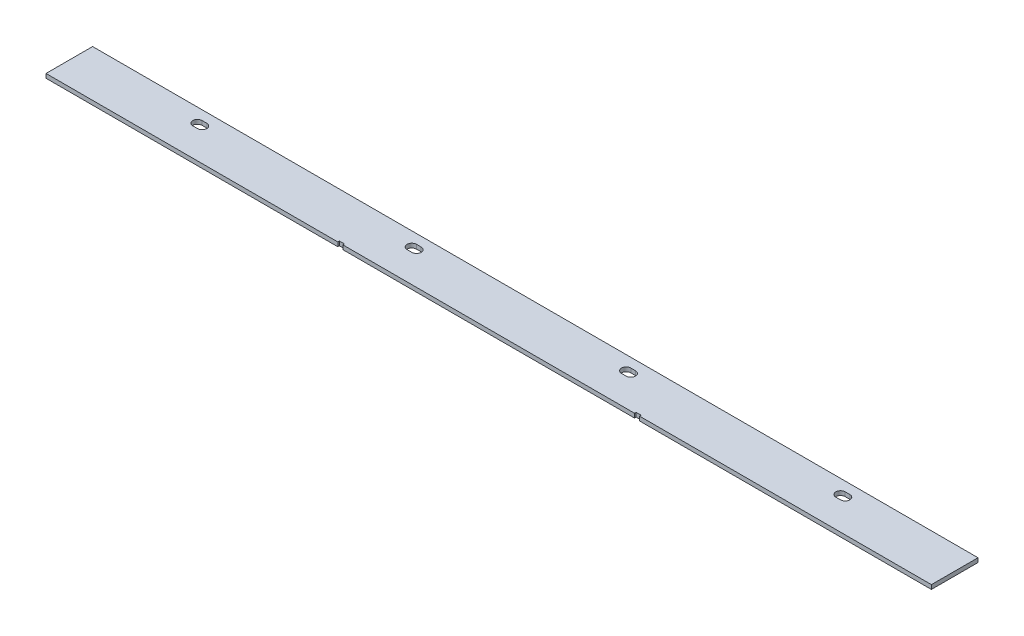
ISO-10303-21;
HEADER;
FILE_DESCRIPTION(('STEP AP214'),'2;1');
FILE_NAME('part.step','',(''),(''),'','','');
FILE_SCHEMA(('AUTOMOTIVE_DESIGN { 1 0 10303 214 1 1 1 1 }'));
ENDSEC;
DATA;
#1=APPLICATION_CONTEXT('core data for automotive mechanical design processes');
#2=APPLICATION_PROTOCOL_DEFINITION('international standard','automotive_design',2000,#1);
#3=PRODUCT_CONTEXT('',#1,'mechanical');
#4=PRODUCT('Part','Part','',(#3));
#5=PRODUCT_RELATED_PRODUCT_CATEGORY('part','',(#4));
#6=PRODUCT_DEFINITION_FORMATION('','',#4);
#7=PRODUCT_DEFINITION_CONTEXT('part definition',#1,'design');
#8=PRODUCT_DEFINITION('design','',#6,#7);
#9=PRODUCT_DEFINITION_SHAPE('','',#8);
#10=(LENGTH_UNIT() NAMED_UNIT(*) SI_UNIT(.MILLI.,.METRE.));
#11=(NAMED_UNIT(*) PLANE_ANGLE_UNIT() SI_UNIT($,.RADIAN.));
#12=(NAMED_UNIT(*) SI_UNIT($,.STERADIAN.) SOLID_ANGLE_UNIT());
#13=UNCERTAINTY_MEASURE_WITH_UNIT(LENGTH_MEASURE(1.E-05),#10,'distance_accuracy_value','');
#14=(GEOMETRIC_REPRESENTATION_CONTEXT(3) GLOBAL_UNCERTAINTY_ASSIGNED_CONTEXT((#13)) GLOBAL_UNIT_ASSIGNED_CONTEXT((#10,
#11,#12)) REPRESENTATION_CONTEXT('',''));
#15=CARTESIAN_POINT('',(0.,0.,0.));
#16=DIRECTION('',(0.,0.,1.));
#17=DIRECTION('',(1.,0.,0.));
#18=AXIS2_PLACEMENT_3D('',#15,#16,#17);
#19=CARTESIAN_POINT('',(335.75,-495.5,1.5));
#20=DIRECTION('',(0.,1.,0.));
#21=DIRECTION('',(0.,0.,1.));
#22=AXIS2_PLACEMENT_3D('',#19,#20,#21);
#23=PLANE('',#22);
#24=DIRECTION('',(-1.,0.,0.));
#25=VECTOR('',#24,1.);
#26=CARTESIAN_POINT('',(233.25,-495.5,10.));
#27=LINE('',#26,#25);
#28=CARTESIAN_POINT('',(233.25,-495.5,10.));
#29=VERTEX_POINT('',#28);
#30=CARTESIAN_POINT('',(238.25,-495.5,10.));
#31=VERTEX_POINT('',#30);
#32=EDGE_CURVE('E395',#29,#31,#27,.F.);
#33=ORIENTED_EDGE('',*,*,#32,.T.);
#34=CARTESIAN_POINT('',(238.25,-495.5,15.));
#35=DIRECTION('',(0.,1.,0.));
#36=DIRECTION('',(0.,0.,1.));
#37=AXIS2_PLACEMENT_3D('',#34,#35,#36);
#38=CIRCLE('',#37,4.99999999999999);
#39=CARTESIAN_POINT('',(238.25,-495.5,20.));
#40=VERTEX_POINT('',#39);
#41=EDGE_CURVE('E381',#31,#40,#38,.F.);
#42=ORIENTED_EDGE('',*,*,#41,.T.);
#43=DIRECTION('',(1.,0.,0.));
#44=VECTOR('',#43,1.);
#45=CARTESIAN_POINT('',(233.25,-495.5,20.));
#46=LINE('',#45,#44);
#47=CARTESIAN_POINT('',(233.25,-495.5,20.));
#48=VERTEX_POINT('',#47);
#49=EDGE_CURVE('E403',#40,#48,#46,.F.);
#50=ORIENTED_EDGE('',*,*,#49,.T.);
#51=CARTESIAN_POINT('',(233.25,-495.5,15.));
#52=DIRECTION('',(0.,1.,0.));
#53=DIRECTION('',(0.,0.,1.));
#54=AXIS2_PLACEMENT_3D('',#51,#52,#53);
#55=CIRCLE('',#54,4.99999999999999);
#56=EDGE_CURVE('E399',#48,#29,#55,.F.);
#57=ORIENTED_EDGE('',*,*,#56,.T.);
#58=EDGE_LOOP('',(#33,#42,#50,#57));
#59=FACE_BOUND('',#58,.T.);
#60=CARTESIAN_POINT('',(8.25000000000001,-495.5,15.));
#61=DIRECTION('',(0.,1.,0.));
#62=DIRECTION('',(0.,0.,1.));
#63=AXIS2_PLACEMENT_3D('',#60,#61,#62);
#64=CIRCLE('',#63,4.99999999999999);
#65=CARTESIAN_POINT('',(8.25000000000001,-495.5,10.));
#66=VERTEX_POINT('',#65);
#67=CARTESIAN_POINT('',(8.25000000000001,-495.5,20.));
#68=VERTEX_POINT('',#67);
#69=EDGE_CURVE('E418',#66,#68,#64,.F.);
#70=ORIENTED_EDGE('',*,*,#69,.T.);
#71=DIRECTION('',(1.,0.,0.));
#72=VECTOR('',#71,1.);
#73=CARTESIAN_POINT('',(3.25,-495.5,20.));
#74=LINE('',#73,#72);
#75=CARTESIAN_POINT('',(3.25,-495.5,20.));
#76=VERTEX_POINT('',#75);
#77=EDGE_CURVE('E414',#68,#76,#74,.F.);
#78=ORIENTED_EDGE('',*,*,#77,.T.);
#79=CARTESIAN_POINT('',(3.25,-495.5,15.));
#80=DIRECTION('',(0.,1.,0.));
#81=DIRECTION('',(0.,0.,1.));
#82=AXIS2_PLACEMENT_3D('',#79,#80,#81);
#83=CIRCLE('',#82,4.99999999999999);
#84=CARTESIAN_POINT('',(3.24999999999999,-495.5,10.));
#85=VERTEX_POINT('',#84);
#86=EDGE_CURVE('E408',#76,#85,#83,.F.);
#87=ORIENTED_EDGE('',*,*,#86,.T.);
#88=DIRECTION('',(-1.,0.,0.));
#89=VECTOR('',#88,1.);
#90=CARTESIAN_POINT('',(3.25,-495.5,10.));
#91=LINE('',#90,#89);
#92=EDGE_CURVE('E407',#85,#66,#91,.F.);
#93=ORIENTED_EDGE('',*,*,#92,.T.);
#94=EDGE_LOOP('',(#70,#78,#87,#93));
#95=FACE_BOUND('',#94,.T.);
#96=CARTESIAN_POINT('',(-456.75,-495.5,15.));
#97=DIRECTION('',(0.,1.,0.));
#98=DIRECTION('',(0.,0.,1.));
#99=AXIS2_PLACEMENT_3D('',#96,#97,#98);
#100=CIRCLE('',#99,5.);
#101=CARTESIAN_POINT('',(-456.75,-495.5,20.));
#102=VERTEX_POINT('',#101);
#103=CARTESIAN_POINT('',(-456.75,-495.5,10.));
#104=VERTEX_POINT('',#103);
#105=EDGE_CURVE('E364',#102,#104,#100,.F.);
#106=ORIENTED_EDGE('',*,*,#105,.T.);
#107=DIRECTION('',(-1.,0.,0.));
#108=VECTOR('',#107,1.);
#109=CARTESIAN_POINT('',(-456.75,-495.5,10.));
#110=LINE('',#109,#108);
#111=CARTESIAN_POINT('',(-451.75,-495.5,10.));
#112=VERTEX_POINT('',#111);
#113=EDGE_CURVE('E440',#104,#112,#110,.F.);
#114=ORIENTED_EDGE('',*,*,#113,.T.);
#115=CARTESIAN_POINT('',(-451.75,-495.5,15.));
#116=DIRECTION('',(0.,1.,0.));
#117=DIRECTION('',(0.,0.,1.));
#118=AXIS2_PLACEMENT_3D('',#115,#116,#117);
#119=CIRCLE('',#118,5.);
#120=CARTESIAN_POINT('',(-451.75,-495.5,20.));
#121=VERTEX_POINT('',#120);
#122=EDGE_CURVE('E436',#112,#121,#119,.F.);
#123=ORIENTED_EDGE('',*,*,#122,.T.);
#124=DIRECTION('',(1.,0.,0.));
#125=VECTOR('',#124,1.);
#126=CARTESIAN_POINT('',(-456.75,-495.5,20.));
#127=LINE('',#126,#125);
#128=EDGE_CURVE('E447',#121,#102,#127,.F.);
#129=ORIENTED_EDGE('',*,*,#128,.T.);
#130=EDGE_LOOP('',(#106,#114,#123,#129));
#131=FACE_BOUND('',#130,.T.);
#132=DIRECTION('',(1.,0.,0.));
#133=VECTOR('',#132,1.);
#134=CARTESIAN_POINT('',(-226.75,-495.5,20.));
#135=LINE('',#134,#133);
#136=CARTESIAN_POINT('',(-221.75,-495.5,20.));
#137=VERTEX_POINT('',#136);
#138=CARTESIAN_POINT('',(-226.75,-495.5,20.));
#139=VERTEX_POINT('',#138);
#140=EDGE_CURVE('E422',#137,#139,#135,.F.);
#141=ORIENTED_EDGE('',*,*,#140,.T.);
#142=CARTESIAN_POINT('',(-226.75,-495.5,15.));
#143=DIRECTION('',(0.,1.,0.));
#144=DIRECTION('',(0.,0.,1.));
#145=AXIS2_PLACEMENT_3D('',#142,#143,#144);
#146=CIRCLE('',#145,4.99999999999999);
#147=CARTESIAN_POINT('',(-226.75,-495.5,10.));
#148=VERTEX_POINT('',#147);
#149=EDGE_CURVE('E433',#139,#148,#146,.F.);
#150=ORIENTED_EDGE('',*,*,#149,.T.);
#151=DIRECTION('',(-1.,0.,0.));
#152=VECTOR('',#151,1.);
#153=CARTESIAN_POINT('',(-226.75,-495.5,10.));
#154=LINE('',#153,#152);
#155=CARTESIAN_POINT('',(-221.75,-495.5,10.));
#156=VERTEX_POINT('',#155);
#157=EDGE_CURVE('E429',#148,#156,#154,.F.);
#158=ORIENTED_EDGE('',*,*,#157,.T.);
#159=CARTESIAN_POINT('',(-221.75,-495.5,15.));
#160=DIRECTION('',(0.,1.,0.));
#161=DIRECTION('',(0.,0.,1.));
#162=AXIS2_PLACEMENT_3D('',#159,#160,#161);
#163=CIRCLE('',#162,4.99999999999999);
#164=EDGE_CURVE('E423',#156,#137,#163,.F.);
#165=ORIENTED_EDGE('',*,*,#164,.T.);
#166=EDGE_LOOP('',(#141,#150,#158,#165));
#167=FACE_BOUND('',#166,.T.);
#168=DIRECTION('',(-1.,0.,0.));
#169=VECTOR('',#168,1.);
#170=CARTESIAN_POINT('',(0.,-495.5,50.));
#171=LINE('',#170,#169);
#172=CARTESIAN_POINT('',(-271.116666666667,-495.5,50.));
#173=VERTEX_POINT('',#172);
#174=CARTESIAN_POINT('',(-584.25,-495.5,50.));
#175=VERTEX_POINT('',#174);
#176=EDGE_CURVE('E358',#173,#175,#171,.T.);
#177=ORIENTED_EDGE('',*,*,#176,.F.);
#178=DIRECTION('',(0.,0.,-1.));
#179=VECTOR('',#178,1.);
#180=CARTESIAN_POINT('',(-271.116666666667,-495.5,50.2));
#181=LINE('',#180,#179);
#182=CARTESIAN_POINT('',(-271.116666666667,-495.5,48.2999999999999));
#183=VERTEX_POINT('',#182);
#184=EDGE_CURVE('E288',#173,#183,#181,.T.);
#185=ORIENTED_EDGE('',*,*,#184,.T.);
#186=DIRECTION('',(-1.,0.,0.));
#187=VECTOR('',#186,1.);
#188=CARTESIAN_POINT('',(-271.116666666667,-495.5,48.2999999999999));
#189=LINE('',#188,#187);
#190=CARTESIAN_POINT('',(-265.716666666667,-495.5,48.2999999999999));
#191=VERTEX_POINT('',#190);
#192=EDGE_CURVE('E277',#191,#183,#189,.T.);
#193=ORIENTED_EDGE('',*,*,#192,.F.);
#194=DIRECTION('',(0.,0.,-1.));
#195=VECTOR('',#194,1.);
#196=CARTESIAN_POINT('',(-265.716666666667,-495.5,50.2));
#197=LINE('',#196,#195);
#198=CARTESIAN_POINT('',(-265.716666666667,-495.5,50.));
#199=VERTEX_POINT('',#198);
#200=EDGE_CURVE('E290',#199,#191,#197,.T.);
#201=ORIENTED_EDGE('',*,*,#200,.F.);
#202=CARTESIAN_POINT('',(47.2166666666666,-495.5,50.));
#203=VERTEX_POINT('',#202);
#204=EDGE_CURVE('E346',#203,#199,#171,.T.);
#205=ORIENTED_EDGE('',*,*,#204,.F.);
#206=DIRECTION('',(0.,0.,-1.));
#207=VECTOR('',#206,1.);
#208=CARTESIAN_POINT('',(47.2166666666666,-495.5,50.2));
#209=LINE('',#208,#207);
#210=CARTESIAN_POINT('',(47.2166666666666,-495.5,48.2999999999999));
#211=VERTEX_POINT('',#210);
#212=EDGE_CURVE('E305',#203,#211,#209,.T.);
#213=ORIENTED_EDGE('',*,*,#212,.T.);
#214=DIRECTION('',(-1.,0.,0.));
#215=VECTOR('',#214,1.);
#216=CARTESIAN_POINT('',(47.2166666666666,-495.5,48.2999999999999));
#217=LINE('',#216,#215);
#218=CARTESIAN_POINT('',(52.6166666666666,-495.5,48.2999999999999));
#219=VERTEX_POINT('',#218);
#220=EDGE_CURVE('E302',#219,#211,#217,.T.);
#221=ORIENTED_EDGE('',*,*,#220,.F.);
#222=DIRECTION('',(0.,0.,-1.));
#223=VECTOR('',#222,1.);
#224=CARTESIAN_POINT('',(52.6166666666666,-495.5,50.2));
#225=LINE('',#224,#223);
#226=CARTESIAN_POINT('',(52.6166666666666,-495.5,50.));
#227=VERTEX_POINT('',#226);
#228=EDGE_CURVE('E308',#227,#219,#225,.T.);
#229=ORIENTED_EDGE('',*,*,#228,.F.);
#230=CARTESIAN_POINT('',(365.75,-495.5,50.));
#231=VERTEX_POINT('',#230);
#232=EDGE_CURVE('E319',#231,#227,#171,.T.);
#233=ORIENTED_EDGE('',*,*,#232,.F.);
#234=DIRECTION('',(0.,0.,-1.));
#235=VECTOR('',#234,1.);
#236=CARTESIAN_POINT('',(365.75,-495.5,50.));
#237=LINE('',#236,#235);
#238=CARTESIAN_POINT('',(365.75,-495.5,0.));
#239=VERTEX_POINT('',#238);
#240=EDGE_CURVE('E361',#231,#239,#237,.T.);
#241=ORIENTED_EDGE('',*,*,#240,.T.);
#242=DIRECTION('',(1.,0.,0.));
#243=VECTOR('',#242,1.);
#244=CARTESIAN_POINT('',(0.,-495.5,0.));
#245=LINE('',#244,#243);
#246=CARTESIAN_POINT('',(-584.25,-495.5,0.));
#247=VERTEX_POINT('',#246);
#248=EDGE_CURVE('E322',#239,#247,#245,.F.);
#249=ORIENTED_EDGE('',*,*,#248,.T.);
#250=DIRECTION('',(0.,0.,1.));
#251=VECTOR('',#250,1.);
#252=CARTESIAN_POINT('',(-584.25,-495.5,50.));
#253=LINE('',#252,#251);
#254=EDGE_CURVE('E269',#247,#175,#253,.T.);
#255=ORIENTED_EDGE('',*,*,#254,.T.);
#256=EDGE_LOOP('',(#177,#185,#193,#201,#205,#213,#221,#229,#233,#241,#249,#255));
#257=FACE_BOUND('',#256,.T.);
#258=ADVANCED_FACE('F42',(#59,#95,#131,#167,#257),#23,.T.);
#259=CARTESIAN_POINT('',(-584.25,-500.,50.));
#260=DIRECTION('',(0.,1.,0.));
#261=DIRECTION('',(0.,0.,1.));
#262=AXIS2_PLACEMENT_3D('',#259,#260,#261);
#263=PLANE('',#262);
#264=DIRECTION('',(1.,0.,0.));
#265=VECTOR('',#264,1.);
#266=CARTESIAN_POINT('',(-584.25,-500.,10.));
#267=LINE('',#266,#265);
#268=CARTESIAN_POINT('',(233.25,-500.,10.));
#269=VERTEX_POINT('',#268);
#270=CARTESIAN_POINT('',(238.25,-500.,10.));
#271=VERTEX_POINT('',#270);
#272=EDGE_CURVE('E328',#269,#271,#267,.T.);
#273=ORIENTED_EDGE('',*,*,#272,.F.);
#274=CARTESIAN_POINT('',(233.25,-500.,15.));
#275=DIRECTION('',(0.,1.,0.));
#276=DIRECTION('',(0.,0.,1.));
#277=AXIS2_PLACEMENT_3D('',#274,#275,#276);
#278=CIRCLE('',#277,4.99999999999999);
#279=CARTESIAN_POINT('',(233.25,-500.,20.));
#280=VERTEX_POINT('',#279);
#281=EDGE_CURVE('E461',#280,#269,#278,.F.);
#282=ORIENTED_EDGE('',*,*,#281,.F.);
#283=DIRECTION('',(1.,0.,0.));
#284=VECTOR('',#283,1.);
#285=CARTESIAN_POINT('',(-584.25,-500.,20.));
#286=LINE('',#285,#284);
#287=CARTESIAN_POINT('',(238.25,-500.,20.));
#288=VERTEX_POINT('',#287);
#289=EDGE_CURVE('E463',#288,#280,#286,.F.);
#290=ORIENTED_EDGE('',*,*,#289,.F.);
#291=CARTESIAN_POINT('',(238.25,-500.,15.));
#292=DIRECTION('',(0.,1.,0.));
#293=DIRECTION('',(0.,0.,1.));
#294=AXIS2_PLACEMENT_3D('',#291,#292,#293);
#295=CIRCLE('',#294,4.99999999999999);
#296=EDGE_CURVE('E340',#271,#288,#295,.F.);
#297=ORIENTED_EDGE('',*,*,#296,.F.);
#298=EDGE_LOOP('',(#273,#282,#290,#297));
#299=FACE_BOUND('',#298,.T.);
#300=CARTESIAN_POINT('',(3.25,-500.,15.));
#301=DIRECTION('',(0.,1.,0.));
#302=DIRECTION('',(0.,0.,1.));
#303=AXIS2_PLACEMENT_3D('',#300,#301,#302);
#304=CIRCLE('',#303,4.99999999999999);
#305=CARTESIAN_POINT('',(3.24999999999999,-500.,20.));
#306=VERTEX_POINT('',#305);
#307=CARTESIAN_POINT('',(3.24999999999999,-500.,10.));
#308=VERTEX_POINT('',#307);
#309=EDGE_CURVE('E464',#306,#308,#304,.F.);
#310=ORIENTED_EDGE('',*,*,#309,.F.);
#311=DIRECTION('',(1.,0.,0.));
#312=VECTOR('',#311,1.);
#313=CARTESIAN_POINT('',(-584.25,-500.,20.));
#314=LINE('',#313,#312);
#315=CARTESIAN_POINT('',(8.25,-500.,20.));
#316=VERTEX_POINT('',#315);
#317=EDGE_CURVE('E467',#316,#306,#314,.F.);
#318=ORIENTED_EDGE('',*,*,#317,.F.);
#319=CARTESIAN_POINT('',(8.25000000000001,-500.,15.));
#320=DIRECTION('',(0.,1.,0.));
#321=DIRECTION('',(0.,0.,1.));
#322=AXIS2_PLACEMENT_3D('',#319,#320,#321);
#323=CIRCLE('',#322,4.99999999999999);
#324=CARTESIAN_POINT('',(8.25,-500.,10.));
#325=VERTEX_POINT('',#324);
#326=EDGE_CURVE('E468',#325,#316,#323,.F.);
#327=ORIENTED_EDGE('',*,*,#326,.F.);
#328=DIRECTION('',(1.,0.,0.));
#329=VECTOR('',#328,1.);
#330=CARTESIAN_POINT('',(-584.25,-500.,10.));
#331=LINE('',#330,#329);
#332=EDGE_CURVE('E466',#308,#325,#331,.T.);
#333=ORIENTED_EDGE('',*,*,#332,.F.);
#334=EDGE_LOOP('',(#310,#318,#327,#333));
#335=FACE_BOUND('',#334,.T.);
#336=CARTESIAN_POINT('',(-221.75,-500.,15.));
#337=DIRECTION('',(0.,1.,0.));
#338=DIRECTION('',(0.,0.,1.));
#339=AXIS2_PLACEMENT_3D('',#336,#337,#338);
#340=CIRCLE('',#339,4.99999999999999);
#341=CARTESIAN_POINT('',(-221.75,-500.,10.));
#342=VERTEX_POINT('',#341);
#343=CARTESIAN_POINT('',(-221.75,-500.,20.));
#344=VERTEX_POINT('',#343);
#345=EDGE_CURVE('E471',#342,#344,#340,.F.);
#346=ORIENTED_EDGE('',*,*,#345,.F.);
#347=DIRECTION('',(1.,0.,0.));
#348=VECTOR('',#347,1.);
#349=CARTESIAN_POINT('',(-584.25,-500.,10.));
#350=LINE('',#349,#348);
#351=CARTESIAN_POINT('',(-226.75,-500.,10.));
#352=VERTEX_POINT('',#351);
#353=EDGE_CURVE('E473',#352,#342,#350,.T.);
#354=ORIENTED_EDGE('',*,*,#353,.F.);
#355=CARTESIAN_POINT('',(-226.75,-500.,15.));
#356=DIRECTION('',(0.,1.,0.));
#357=DIRECTION('',(0.,0.,1.));
#358=AXIS2_PLACEMENT_3D('',#355,#356,#357);
#359=CIRCLE('',#358,4.99999999999999);
#360=CARTESIAN_POINT('',(-226.75,-500.,20.));
#361=VERTEX_POINT('',#360);
#362=EDGE_CURVE('E474',#361,#352,#359,.F.);
#363=ORIENTED_EDGE('',*,*,#362,.F.);
#364=DIRECTION('',(1.,0.,0.));
#365=VECTOR('',#364,1.);
#366=CARTESIAN_POINT('',(-584.25,-500.,20.));
#367=LINE('',#366,#365);
#368=EDGE_CURVE('E470',#344,#361,#367,.F.);
#369=ORIENTED_EDGE('',*,*,#368,.F.);
#370=EDGE_LOOP('',(#346,#354,#363,#369));
#371=FACE_BOUND('',#370,.T.);
#372=DIRECTION('',(1.,0.,0.));
#373=VECTOR('',#372,1.);
#374=CARTESIAN_POINT('',(-584.25,-500.,10.));
#375=LINE('',#374,#373);
#376=CARTESIAN_POINT('',(-456.75,-500.,10.));
#377=VERTEX_POINT('',#376);
#378=CARTESIAN_POINT('',(-451.75,-500.,10.));
#379=VERTEX_POINT('',#378);
#380=EDGE_CURVE('E479',#377,#379,#375,.T.);
#381=ORIENTED_EDGE('',*,*,#380,.F.);
#382=CARTESIAN_POINT('',(-456.75,-500.,15.));
#383=DIRECTION('',(0.,1.,0.));
#384=DIRECTION('',(0.,0.,1.));
#385=AXIS2_PLACEMENT_3D('',#382,#383,#384);
#386=CIRCLE('',#385,5.);
#387=CARTESIAN_POINT('',(-456.75,-500.,20.));
#388=VERTEX_POINT('',#387);
#389=EDGE_CURVE('E480',#388,#377,#386,.F.);
#390=ORIENTED_EDGE('',*,*,#389,.F.);
#391=DIRECTION('',(1.,0.,0.));
#392=VECTOR('',#391,1.);
#393=CARTESIAN_POINT('',(-584.25,-500.,20.));
#394=LINE('',#393,#392);
#395=CARTESIAN_POINT('',(-451.75,-500.,20.));
#396=VERTEX_POINT('',#395);
#397=EDGE_CURVE('E391',#396,#388,#394,.F.);
#398=ORIENTED_EDGE('',*,*,#397,.F.);
#399=CARTESIAN_POINT('',(-451.75,-500.,15.));
#400=DIRECTION('',(0.,1.,0.));
#401=DIRECTION('',(0.,0.,1.));
#402=AXIS2_PLACEMENT_3D('',#399,#400,#401);
#403=CIRCLE('',#402,5.);
#404=EDGE_CURVE('E476',#379,#396,#403,.F.);
#405=ORIENTED_EDGE('',*,*,#404,.F.);
#406=EDGE_LOOP('',(#381,#390,#398,#405));
#407=FACE_BOUND('',#406,.T.);
#408=DIRECTION('',(0.,0.,-1.));
#409=VECTOR('',#408,1.);
#410=CARTESIAN_POINT('',(-271.116666666667,-500.,50.2));
#411=LINE('',#410,#409);
#412=CARTESIAN_POINT('',(-271.116666666667,-500.,50.));
#413=VERTEX_POINT('',#412);
#414=CARTESIAN_POINT('',(-271.116666666667,-500.,48.2999999999999));
#415=VERTEX_POINT('',#414);
#416=EDGE_CURVE('E260',#413,#415,#411,.T.);
#417=ORIENTED_EDGE('',*,*,#416,.F.);
#418=DIRECTION('',(1.,0.,0.));
#419=VECTOR('',#418,1.);
#420=CARTESIAN_POINT('',(0.,-500.,50.));
#421=LINE('',#420,#419);
#422=CARTESIAN_POINT('',(-584.25,-500.,50.));
#423=VERTEX_POINT('',#422);
#424=EDGE_CURVE('E320',#423,#413,#421,.T.);
#425=ORIENTED_EDGE('',*,*,#424,.F.);
#426=DIRECTION('',(0.,0.,1.));
#427=VECTOR('',#426,1.);
#428=CARTESIAN_POINT('',(-584.25,-500.,50.));
#429=LINE('',#428,#427);
#430=CARTESIAN_POINT('',(-584.25,-500.,0.));
#431=VERTEX_POINT('',#430);
#432=EDGE_CURVE('E312',#431,#423,#429,.T.);
#433=ORIENTED_EDGE('',*,*,#432,.F.);
#434=DIRECTION('',(1.,0.,0.));
#435=VECTOR('',#434,1.);
#436=CARTESIAN_POINT('',(-584.25,-500.,0.));
#437=LINE('',#436,#435);
#438=CARTESIAN_POINT('',(365.75,-500.,0.));
#439=VERTEX_POINT('',#438);
#440=EDGE_CURVE('E379',#439,#431,#437,.F.);
#441=ORIENTED_EDGE('',*,*,#440,.F.);
#442=DIRECTION('',(0.,0.,1.));
#443=VECTOR('',#442,1.);
#444=CARTESIAN_POINT('',(365.75,-500.,50.));
#445=LINE('',#444,#443);
#446=CARTESIAN_POINT('',(365.75,-500.,50.));
#447=VERTEX_POINT('',#446);
#448=EDGE_CURVE('E316',#447,#439,#445,.F.);
#449=ORIENTED_EDGE('',*,*,#448,.F.);
#450=CARTESIAN_POINT('',(52.6166666666666,-500.,50.));
#451=VERTEX_POINT('',#450);
#452=EDGE_CURVE('E324',#451,#447,#421,.T.);
#453=ORIENTED_EDGE('',*,*,#452,.F.);
#454=DIRECTION('',(0.,0.,-1.));
#455=VECTOR('',#454,1.);
#456=CARTESIAN_POINT('',(52.6166666666666,-500.,50.2));
#457=LINE('',#456,#455);
#458=CARTESIAN_POINT('',(52.6166666666666,-500.,48.2999999999999));
#459=VERTEX_POINT('',#458);
#460=EDGE_CURVE('E57',#451,#459,#457,.T.);
#461=ORIENTED_EDGE('',*,*,#460,.T.);
#462=DIRECTION('',(1.,0.,0.));
#463=VECTOR('',#462,1.);
#464=CARTESIAN_POINT('',(47.2166666666666,-500.,48.2999999999999));
#465=LINE('',#464,#463);
#466=CARTESIAN_POINT('',(47.2166666666666,-500.,48.2999999999999));
#467=VERTEX_POINT('',#466);
#468=EDGE_CURVE('E296',#467,#459,#465,.T.);
#469=ORIENTED_EDGE('',*,*,#468,.F.);
#470=DIRECTION('',(0.,0.,-1.));
#471=VECTOR('',#470,1.);
#472=CARTESIAN_POINT('',(47.2166666666666,-500.,50.2));
#473=LINE('',#472,#471);
#474=CARTESIAN_POINT('',(47.2166666666666,-500.,50.));
#475=VERTEX_POINT('',#474);
#476=EDGE_CURVE('E279',#475,#467,#473,.T.);
#477=ORIENTED_EDGE('',*,*,#476,.F.);
#478=CARTESIAN_POINT('',(-265.716666666667,-500.,50.));
#479=VERTEX_POINT('',#478);
#480=EDGE_CURVE('E323',#479,#475,#421,.T.);
#481=ORIENTED_EDGE('',*,*,#480,.F.);
#482=DIRECTION('',(0.,0.,-1.));
#483=VECTOR('',#482,1.);
#484=CARTESIAN_POINT('',(-265.716666666667,-500.,50.2));
#485=LINE('',#484,#483);
#486=CARTESIAN_POINT('',(-265.716666666667,-500.,48.2999999999999));
#487=VERTEX_POINT('',#486);
#488=EDGE_CURVE('E65',#479,#487,#485,.T.);
#489=ORIENTED_EDGE('',*,*,#488,.T.);
#490=DIRECTION('',(1.,0.,0.));
#491=VECTOR('',#490,1.);
#492=CARTESIAN_POINT('',(-271.116666666667,-500.,48.2999999999999));
#493=LINE('',#492,#491);
#494=EDGE_CURVE('E275',#415,#487,#493,.T.);
#495=ORIENTED_EDGE('',*,*,#494,.F.);
#496=EDGE_LOOP('',(#417,#425,#433,#441,#449,#453,#461,#469,#477,#481,#489,#495));
#497=FACE_BOUND('',#496,.T.);
#498=ADVANCED_FACE('F281',(#299,#335,#371,#407,#497),#263,.F.);
#499=CARTESIAN_POINT('',(0.,0.,50.));
#500=DIRECTION('',(0.,0.,1.));
#501=DIRECTION('',(1.,0.,0.));
#502=AXIS2_PLACEMENT_3D('',#499,#500,#501);
#503=PLANE('',#502);
#504=ORIENTED_EDGE('',*,*,#424,.T.);
#505=DIRECTION('',(0.,1.,0.));
#506=VECTOR('',#505,1.);
#507=CARTESIAN_POINT('',(-271.116666666667,0.,50.));
#508=LINE('',#507,#506);
#509=EDGE_CURVE('E11',#413,#173,#508,.T.);
#510=ORIENTED_EDGE('',*,*,#509,.T.);
#511=ORIENTED_EDGE('',*,*,#176,.T.);
#512=DIRECTION('',(0.,1.,0.));
#513=VECTOR('',#512,1.);
#514=CARTESIAN_POINT('',(-584.25,0.,50.));
#515=LINE('',#514,#513);
#516=EDGE_CURVE('E327',#175,#423,#515,.F.);
#517=ORIENTED_EDGE('',*,*,#516,.T.);
#518=EDGE_LOOP('',(#504,#510,#511,#517));
#519=FACE_BOUND('',#518,.T.);
#520=ADVANCED_FACE('F44',(#519),#503,.T.);
#521=ORIENTED_EDGE('',*,*,#204,.T.);
#522=DIRECTION('',(0.,-1.,0.));
#523=VECTOR('',#522,1.);
#524=CARTESIAN_POINT('',(-265.716666666667,0.,50.));
#525=LINE('',#524,#523);
#526=EDGE_CURVE('E50',#199,#479,#525,.T.);
#527=ORIENTED_EDGE('',*,*,#526,.T.);
#528=ORIENTED_EDGE('',*,*,#480,.T.);
#529=DIRECTION('',(0.,1.,0.));
#530=VECTOR('',#529,1.);
#531=CARTESIAN_POINT('',(47.2166666666666,0.,50.));
#532=LINE('',#531,#530);
#533=EDGE_CURVE('E339',#475,#203,#532,.T.);
#534=ORIENTED_EDGE('',*,*,#533,.T.);
#535=EDGE_LOOP('',(#521,#527,#528,#534));
#536=FACE_BOUND('',#535,.T.);
#537=ADVANCED_FACE('F344',(#536),#503,.T.);
#538=ORIENTED_EDGE('',*,*,#232,.T.);
#539=DIRECTION('',(0.,-1.,0.));
#540=VECTOR('',#539,1.);
#541=CARTESIAN_POINT('',(52.6166666666666,0.,50.));
#542=LINE('',#541,#540);
#543=EDGE_CURVE('E337',#227,#451,#542,.T.);
#544=ORIENTED_EDGE('',*,*,#543,.T.);
#545=ORIENTED_EDGE('',*,*,#452,.T.);
#546=DIRECTION('',(0.,1.,0.));
#547=VECTOR('',#546,1.);
#548=CARTESIAN_POINT('',(365.75,0.,50.));
#549=LINE('',#548,#547);
#550=EDGE_CURVE('E315',#447,#231,#549,.T.);
#551=ORIENTED_EDGE('',*,*,#550,.T.);
#552=EDGE_LOOP('',(#538,#544,#545,#551));
#553=FACE_BOUND('',#552,.T.);
#554=ADVANCED_FACE('F614',(#553),#503,.T.);
#555=CARTESIAN_POINT('',(238.25,-495.5,15.));
#556=DIRECTION('',(0.,1.,0.));
#557=DIRECTION('',(0.,0.,1.));
#558=AXIS2_PLACEMENT_3D('',#555,#556,#557);
#559=CYLINDRICAL_SURFACE('',#558,4.99999999999999);
#560=DIRECTION('',(0.,1.,0.));
#561=VECTOR('',#560,1.);
#562=CARTESIAN_POINT('',(238.25,-495.5,20.));
#563=LINE('',#562,#561);
#564=EDGE_CURVE('E374',#40,#288,#563,.F.);
#565=ORIENTED_EDGE('',*,*,#564,.F.);
#566=ORIENTED_EDGE('',*,*,#41,.F.);
#567=DIRECTION('',(0.,1.,0.));
#568=VECTOR('',#567,1.);
#569=CARTESIAN_POINT('',(238.25,-495.5,10.));
#570=LINE('',#569,#568);
#571=EDGE_CURVE('E387',#271,#31,#570,.T.);
#572=ORIENTED_EDGE('',*,*,#571,.F.);
#573=ORIENTED_EDGE('',*,*,#296,.T.);
#574=EDGE_LOOP('',(#565,#566,#572,#573));
#575=FACE_BOUND('',#574,.T.);
#576=ADVANCED_FACE('F533',(#575),#559,.F.);
#577=CARTESIAN_POINT('',(3.25,-495.5,20.));
#578=DIRECTION('',(0.,0.,1.));
#579=DIRECTION('',(1.,0.,0.));
#580=AXIS2_PLACEMENT_3D('',#577,#578,#579);
#581=PLANE('',#580);
#582=DIRECTION('',(0.,1.,0.));
#583=VECTOR('',#582,1.);
#584=CARTESIAN_POINT('',(3.25,-495.5,20.));
#585=LINE('',#584,#583);
#586=EDGE_CURVE('E411',#306,#76,#585,.T.);
#587=ORIENTED_EDGE('',*,*,#586,.T.);
#588=ORIENTED_EDGE('',*,*,#77,.F.);
#589=DIRECTION('',(0.,1.,0.));
#590=VECTOR('',#589,1.);
#591=CARTESIAN_POINT('',(8.25,-495.5,20.));
#592=LINE('',#591,#590);
#593=EDGE_CURVE('E415',#316,#68,#592,.T.);
#594=ORIENTED_EDGE('',*,*,#593,.F.);
#595=ORIENTED_EDGE('',*,*,#317,.T.);
#596=EDGE_LOOP('',(#587,#588,#594,#595));
#597=FACE_BOUND('',#596,.T.);
#598=ADVANCED_FACE('F548',(#597),#581,.F.);
#599=CARTESIAN_POINT('',(-456.75,-495.5,10.));
#600=DIRECTION('',(0.,0.,-1.));
#601=DIRECTION('',(-1.,0.,0.));
#602=AXIS2_PLACEMENT_3D('',#599,#600,#601);
#603=PLANE('',#602);
#604=DIRECTION('',(0.,1.,0.));
#605=VECTOR('',#604,1.);
#606=CARTESIAN_POINT('',(-451.75,-495.5,10.));
#607=LINE('',#606,#605);
#608=EDGE_CURVE('E437',#379,#112,#607,.T.);
#609=ORIENTED_EDGE('',*,*,#608,.T.);
#610=ORIENTED_EDGE('',*,*,#113,.F.);
#611=DIRECTION('',(0.,1.,0.));
#612=VECTOR('',#611,1.);
#613=CARTESIAN_POINT('',(-456.75,-495.5,10.));
#614=LINE('',#613,#612);
#615=EDGE_CURVE('E441',#377,#104,#614,.T.);
#616=ORIENTED_EDGE('',*,*,#615,.F.);
#617=ORIENTED_EDGE('',*,*,#380,.T.);
#618=EDGE_LOOP('',(#609,#610,#616,#617));
#619=FACE_BOUND('',#618,.T.);
#620=ADVANCED_FACE('F508',(#619),#603,.F.);
#621=CARTESIAN_POINT('',(-226.75,-495.5,15.));
#622=DIRECTION('',(0.,1.,0.));
#623=DIRECTION('',(0.,0.,1.));
#624=AXIS2_PLACEMENT_3D('',#621,#622,#623);
#625=CYLINDRICAL_SURFACE('',#624,4.99999999999999);
#626=DIRECTION('',(0.,1.,0.));
#627=VECTOR('',#626,1.);
#628=CARTESIAN_POINT('',(-226.75,-495.5,10.));
#629=LINE('',#628,#627);
#630=EDGE_CURVE('E430',#352,#148,#629,.T.);
#631=ORIENTED_EDGE('',*,*,#630,.T.);
#632=ORIENTED_EDGE('',*,*,#149,.F.);
#633=DIRECTION('',(0.,1.,0.));
#634=VECTOR('',#633,1.);
#635=CARTESIAN_POINT('',(-226.75,-495.5,20.));
#636=LINE('',#635,#634);
#637=EDGE_CURVE('E424',#139,#361,#636,.F.);
#638=ORIENTED_EDGE('',*,*,#637,.T.);
#639=ORIENTED_EDGE('',*,*,#362,.T.);
#640=EDGE_LOOP('',(#631,#632,#638,#639));
#641=FACE_BOUND('',#640,.T.);
#642=ADVANCED_FACE('F576',(#641),#625,.F.);
#643=CARTESIAN_POINT('',(-584.25,500.,50.));
#644=DIRECTION('',(1.,0.,0.));
#645=DIRECTION('',(0.,1.,0.));
#646=AXIS2_PLACEMENT_3D('',#643,#644,#645);
#647=PLANE('',#646);
#648=ORIENTED_EDGE('',*,*,#254,.F.);
#649=DIRECTION('',(0.,1.,0.));
#650=VECTOR('',#649,1.);
#651=CARTESIAN_POINT('',(-584.25,500.,0.));
#652=LINE('',#651,#650);
#653=EDGE_CURVE('E373',#431,#247,#652,.T.);
#654=ORIENTED_EDGE('',*,*,#653,.F.);
#655=ORIENTED_EDGE('',*,*,#432,.T.);
#656=ORIENTED_EDGE('',*,*,#516,.F.);
#657=EDGE_LOOP('',(#648,#654,#655,#656));
#658=FACE_BOUND('',#657,.T.);
#659=ADVANCED_FACE('F594',(#658),#647,.F.);
#660=CARTESIAN_POINT('',(365.75,500.,50.));
#661=DIRECTION('',(-1.,0.,0.));
#662=DIRECTION('',(0.,-1.,0.));
#663=AXIS2_PLACEMENT_3D('',#660,#661,#662);
#664=PLANE('',#663);
#665=ORIENTED_EDGE('',*,*,#240,.F.);
#666=ORIENTED_EDGE('',*,*,#550,.F.);
#667=ORIENTED_EDGE('',*,*,#448,.T.);
#668=DIRECTION('',(0.,-1.,0.));
#669=VECTOR('',#668,1.);
#670=CARTESIAN_POINT('',(365.75,500.,0.));
#671=LINE('',#670,#669);
#672=EDGE_CURVE('E372',#239,#439,#671,.T.);
#673=ORIENTED_EDGE('',*,*,#672,.F.);
#674=EDGE_LOOP('',(#665,#666,#667,#673));
#675=FACE_BOUND('',#674,.T.);
#676=ADVANCED_FACE('F589',(#675),#664,.F.);
#677=CARTESIAN_POINT('',(0.,0.,0.));
#678=DIRECTION('',(0.,0.,1.));
#679=DIRECTION('',(1.,0.,0.));
#680=AXIS2_PLACEMENT_3D('',#677,#678,#679);
#681=PLANE('',#680);
#682=ORIENTED_EDGE('',*,*,#248,.F.);
#683=ORIENTED_EDGE('',*,*,#672,.T.);
#684=ORIENTED_EDGE('',*,*,#440,.T.);
#685=ORIENTED_EDGE('',*,*,#653,.T.);
#686=EDGE_LOOP('',(#682,#683,#684,#685));
#687=FACE_BOUND('',#686,.T.);
#688=ADVANCED_FACE('F582',(#687),#681,.F.);
#689=CARTESIAN_POINT('',(-226.75,-495.5,10.));
#690=DIRECTION('',(0.,0.,-1.));
#691=DIRECTION('',(-1.,0.,0.));
#692=AXIS2_PLACEMENT_3D('',#689,#690,#691);
#693=PLANE('',#692);
#694=DIRECTION('',(0.,1.,0.));
#695=VECTOR('',#694,1.);
#696=CARTESIAN_POINT('',(-221.75,-495.5,10.));
#697=LINE('',#696,#695);
#698=EDGE_CURVE('E426',#342,#156,#697,.T.);
#699=ORIENTED_EDGE('',*,*,#698,.T.);
#700=ORIENTED_EDGE('',*,*,#157,.F.);
#701=ORIENTED_EDGE('',*,*,#630,.F.);
#702=ORIENTED_EDGE('',*,*,#353,.T.);
#703=EDGE_LOOP('',(#699,#700,#701,#702));
#704=FACE_BOUND('',#703,.T.);
#705=ADVANCED_FACE('F580',(#704),#693,.F.);
#706=CARTESIAN_POINT('',(-226.75,-495.5,20.));
#707=DIRECTION('',(0.,0.,1.));
#708=DIRECTION('',(1.,0.,0.));
#709=AXIS2_PLACEMENT_3D('',#706,#707,#708);
#710=PLANE('',#709);
#711=ORIENTED_EDGE('',*,*,#637,.F.);
#712=ORIENTED_EDGE('',*,*,#140,.F.);
#713=DIRECTION('',(0.,1.,0.));
#714=VECTOR('',#713,1.);
#715=CARTESIAN_POINT('',(-221.75,-495.5,20.));
#716=LINE('',#715,#714);
#717=EDGE_CURVE('E419',#344,#137,#716,.T.);
#718=ORIENTED_EDGE('',*,*,#717,.F.);
#719=ORIENTED_EDGE('',*,*,#368,.T.);
#720=EDGE_LOOP('',(#711,#712,#718,#719));
#721=FACE_BOUND('',#720,.T.);
#722=ADVANCED_FACE('F573',(#721),#710,.F.);
#723=CARTESIAN_POINT('',(-221.75,-495.5,15.));
#724=DIRECTION('',(0.,1.,0.));
#725=DIRECTION('',(0.,0.,1.));
#726=AXIS2_PLACEMENT_3D('',#723,#724,#725);
#727=CYLINDRICAL_SURFACE('',#726,4.99999999999999);
#728=ORIENTED_EDGE('',*,*,#717,.T.);
#729=ORIENTED_EDGE('',*,*,#164,.F.);
#730=ORIENTED_EDGE('',*,*,#698,.F.);
#731=ORIENTED_EDGE('',*,*,#345,.T.);
#732=EDGE_LOOP('',(#728,#729,#730,#731));
#733=FACE_BOUND('',#732,.T.);
#734=ADVANCED_FACE('F568',(#733),#727,.F.);
#735=CARTESIAN_POINT('',(-451.75,-495.5,15.));
#736=DIRECTION('',(0.,1.,0.));
#737=DIRECTION('',(0.,0.,1.));
#738=AXIS2_PLACEMENT_3D('',#735,#736,#737);
#739=CYLINDRICAL_SURFACE('',#738,5.);
#740=DIRECTION('',(0.,1.,0.));
#741=VECTOR('',#740,1.);
#742=CARTESIAN_POINT('',(-451.75,-495.5,20.));
#743=LINE('',#742,#741);
#744=EDGE_CURVE('E434',#121,#396,#743,.F.);
#745=ORIENTED_EDGE('',*,*,#744,.F.);
#746=ORIENTED_EDGE('',*,*,#122,.F.);
#747=ORIENTED_EDGE('',*,*,#608,.F.);
#748=ORIENTED_EDGE('',*,*,#404,.T.);
#749=EDGE_LOOP('',(#745,#746,#747,#748));
#750=FACE_BOUND('',#749,.T.);
#751=ADVANCED_FACE('F498',(#750),#739,.F.);
#752=CARTESIAN_POINT('',(-456.75,-495.5,15.));
#753=DIRECTION('',(0.,1.,0.));
#754=DIRECTION('',(0.,0.,1.));
#755=AXIS2_PLACEMENT_3D('',#752,#753,#754);
#756=CYLINDRICAL_SURFACE('',#755,5.);
#757=ORIENTED_EDGE('',*,*,#615,.T.);
#758=ORIENTED_EDGE('',*,*,#105,.F.);
#759=DIRECTION('',(0.,1.,0.));
#760=VECTOR('',#759,1.);
#761=CARTESIAN_POINT('',(-456.75,-495.5,20.));
#762=LINE('',#761,#760);
#763=EDGE_CURVE('E444',#388,#102,#762,.T.);
#764=ORIENTED_EDGE('',*,*,#763,.F.);
#765=ORIENTED_EDGE('',*,*,#389,.T.);
#766=EDGE_LOOP('',(#757,#758,#764,#765));
#767=FACE_BOUND('',#766,.T.);
#768=ADVANCED_FACE('F505',(#767),#756,.F.);
#769=CARTESIAN_POINT('',(-456.75,-495.5,20.));
#770=DIRECTION('',(0.,0.,1.));
#771=DIRECTION('',(1.,0.,0.));
#772=AXIS2_PLACEMENT_3D('',#769,#770,#771);
#773=PLANE('',#772);
#774=ORIENTED_EDGE('',*,*,#763,.T.);
#775=ORIENTED_EDGE('',*,*,#128,.F.);
#776=ORIENTED_EDGE('',*,*,#744,.T.);
#777=ORIENTED_EDGE('',*,*,#397,.T.);
#778=EDGE_LOOP('',(#774,#775,#776,#777));
#779=FACE_BOUND('',#778,.T.);
#780=ADVANCED_FACE('F495',(#779),#773,.F.);
#781=CARTESIAN_POINT('',(3.25,-495.5,15.));
#782=DIRECTION('',(0.,1.,0.));
#783=DIRECTION('',(0.,0.,1.));
#784=AXIS2_PLACEMENT_3D('',#781,#782,#783);
#785=CYLINDRICAL_SURFACE('',#784,4.99999999999999);
#786=DIRECTION('',(0.,1.,0.));
#787=VECTOR('',#786,1.);
#788=CARTESIAN_POINT('',(3.24999999999999,-495.5,10.));
#789=LINE('',#788,#787);
#790=EDGE_CURVE('E404',#308,#85,#789,.T.);
#791=ORIENTED_EDGE('',*,*,#790,.T.);
#792=ORIENTED_EDGE('',*,*,#86,.F.);
#793=ORIENTED_EDGE('',*,*,#586,.F.);
#794=ORIENTED_EDGE('',*,*,#309,.T.);
#795=EDGE_LOOP('',(#791,#792,#793,#794));
#796=FACE_BOUND('',#795,.T.);
#797=ADVANCED_FACE('F553',(#796),#785,.F.);
#798=CARTESIAN_POINT('',(8.25000000000001,-495.5,15.));
#799=DIRECTION('',(0.,1.,0.));
#800=DIRECTION('',(0.,0.,1.));
#801=AXIS2_PLACEMENT_3D('',#798,#799,#800);
#802=CYLINDRICAL_SURFACE('',#801,4.99999999999999);
#803=ORIENTED_EDGE('',*,*,#593,.T.);
#804=ORIENTED_EDGE('',*,*,#69,.F.);
#805=DIRECTION('',(0.,1.,0.));
#806=VECTOR('',#805,1.);
#807=CARTESIAN_POINT('',(8.25000000000001,-495.5,10.));
#808=LINE('',#807,#806);
#809=EDGE_CURVE('E409',#66,#325,#808,.F.);
#810=ORIENTED_EDGE('',*,*,#809,.T.);
#811=ORIENTED_EDGE('',*,*,#326,.T.);
#812=EDGE_LOOP('',(#803,#804,#810,#811));
#813=FACE_BOUND('',#812,.T.);
#814=ADVANCED_FACE('F544',(#813),#802,.F.);
#815=CARTESIAN_POINT('',(3.25,-495.5,10.));
#816=DIRECTION('',(0.,0.,-1.));
#817=DIRECTION('',(-1.,0.,0.));
#818=AXIS2_PLACEMENT_3D('',#815,#816,#817);
#819=PLANE('',#818);
#820=ORIENTED_EDGE('',*,*,#809,.F.);
#821=ORIENTED_EDGE('',*,*,#92,.F.);
#822=ORIENTED_EDGE('',*,*,#790,.F.);
#823=ORIENTED_EDGE('',*,*,#332,.T.);
#824=EDGE_LOOP('',(#820,#821,#822,#823));
#825=FACE_BOUND('',#824,.T.);
#826=ADVANCED_FACE('F557',(#825),#819,.F.);
#827=CARTESIAN_POINT('',(233.25,-495.5,20.));
#828=DIRECTION('',(0.,0.,1.));
#829=DIRECTION('',(1.,0.,0.));
#830=AXIS2_PLACEMENT_3D('',#827,#828,#829);
#831=PLANE('',#830);
#832=DIRECTION('',(0.,1.,0.));
#833=VECTOR('',#832,1.);
#834=CARTESIAN_POINT('',(233.25,-495.5,20.));
#835=LINE('',#834,#833);
#836=EDGE_CURVE('E400',#280,#48,#835,.T.);
#837=ORIENTED_EDGE('',*,*,#836,.T.);
#838=ORIENTED_EDGE('',*,*,#49,.F.);
#839=ORIENTED_EDGE('',*,*,#564,.T.);
#840=ORIENTED_EDGE('',*,*,#289,.T.);
#841=EDGE_LOOP('',(#837,#838,#839,#840));
#842=FACE_BOUND('',#841,.T.);
#843=ADVANCED_FACE('F517',(#842),#831,.F.);
#844=CARTESIAN_POINT('',(233.25,-495.5,10.));
#845=DIRECTION('',(0.,0.,-1.));
#846=DIRECTION('',(-1.,0.,0.));
#847=AXIS2_PLACEMENT_3D('',#844,#845,#846);
#848=PLANE('',#847);
#849=ORIENTED_EDGE('',*,*,#571,.T.);
#850=ORIENTED_EDGE('',*,*,#32,.F.);
#851=DIRECTION('',(0.,1.,0.));
#852=VECTOR('',#851,1.);
#853=CARTESIAN_POINT('',(233.25,-495.5,10.));
#854=LINE('',#853,#852);
#855=EDGE_CURVE('E396',#269,#29,#854,.T.);
#856=ORIENTED_EDGE('',*,*,#855,.F.);
#857=ORIENTED_EDGE('',*,*,#272,.T.);
#858=EDGE_LOOP('',(#849,#850,#856,#857));
#859=FACE_BOUND('',#858,.T.);
#860=ADVANCED_FACE('F529',(#859),#848,.F.);
#861=CARTESIAN_POINT('',(233.25,-495.5,15.));
#862=DIRECTION('',(0.,1.,0.));
#863=DIRECTION('',(0.,0.,1.));
#864=AXIS2_PLACEMENT_3D('',#861,#862,#863);
#865=CYLINDRICAL_SURFACE('',#864,4.99999999999999);
#866=ORIENTED_EDGE('',*,*,#855,.T.);
#867=ORIENTED_EDGE('',*,*,#56,.F.);
#868=ORIENTED_EDGE('',*,*,#836,.F.);
#869=ORIENTED_EDGE('',*,*,#281,.T.);
#870=EDGE_LOOP('',(#866,#867,#868,#869));
#871=FACE_BOUND('',#870,.T.);
#872=ADVANCED_FACE('F523',(#871),#865,.F.);
#873=CARTESIAN_POINT('',(47.2166666666666,-495.5,50.2));
#874=DIRECTION('',(1.,0.,0.));
#875=DIRECTION('',(0.,0.,-1.));
#876=AXIS2_PLACEMENT_3D('',#873,#874,#875);
#877=PLANE('',#876);
#878=ORIENTED_EDGE('',*,*,#476,.T.);
#879=DIRECTION('',(0.,-1.,0.));
#880=VECTOR('',#879,1.);
#881=CARTESIAN_POINT('',(47.2166666666666,-495.5,48.2999999999999));
#882=LINE('',#881,#880);
#883=EDGE_CURVE('E293',#211,#467,#882,.T.);
#884=ORIENTED_EDGE('',*,*,#883,.F.);
#885=ORIENTED_EDGE('',*,*,#212,.F.);
#886=ORIENTED_EDGE('',*,*,#533,.F.);
#887=EDGE_LOOP('',(#878,#884,#885,#886));
#888=FACE_BOUND('',#887,.T.);
#889=ADVANCED_FACE('F351',(#888),#877,.T.);
#890=CARTESIAN_POINT('',(52.6166666666666,-495.5,50.2));
#891=DIRECTION('',(-1.,0.,0.));
#892=DIRECTION('',(0.,0.,1.));
#893=AXIS2_PLACEMENT_3D('',#890,#891,#892);
#894=PLANE('',#893);
#895=ORIENTED_EDGE('',*,*,#228,.T.);
#896=DIRECTION('',(0.,1.,0.));
#897=VECTOR('',#896,1.);
#898=CARTESIAN_POINT('',(52.6166666666666,-495.5,48.2999999999999));
#899=LINE('',#898,#897);
#900=EDGE_CURVE('E299',#459,#219,#899,.T.);
#901=ORIENTED_EDGE('',*,*,#900,.F.);
#902=ORIENTED_EDGE('',*,*,#460,.F.);
#903=ORIENTED_EDGE('',*,*,#543,.F.);
#904=EDGE_LOOP('',(#895,#901,#902,#903));
#905=FACE_BOUND('',#904,.T.);
#906=ADVANCED_FACE('F676',(#905),#894,.T.);
#907=CARTESIAN_POINT('',(0.,0.,48.2999999999999));
#908=DIRECTION('',(0.,0.,1.));
#909=DIRECTION('',(1.,0.,0.));
#910=AXIS2_PLACEMENT_3D('',#907,#908,#909);
#911=PLANE('',#910);
#912=ORIENTED_EDGE('',*,*,#883,.T.);
#913=ORIENTED_EDGE('',*,*,#468,.T.);
#914=ORIENTED_EDGE('',*,*,#900,.T.);
#915=ORIENTED_EDGE('',*,*,#220,.T.);
#916=EDGE_LOOP('',(#912,#913,#914,#915));
#917=FACE_BOUND('',#916,.T.);
#918=ADVANCED_FACE('F353',(#917),#911,.T.);
#919=CARTESIAN_POINT('',(-271.116666666667,-495.5,50.2));
#920=DIRECTION('',(1.,0.,0.));
#921=DIRECTION('',(0.,0.,-1.));
#922=AXIS2_PLACEMENT_3D('',#919,#920,#921);
#923=PLANE('',#922);
#924=ORIENTED_EDGE('',*,*,#416,.T.);
#925=DIRECTION('',(0.,-1.,0.));
#926=VECTOR('',#925,1.);
#927=CARTESIAN_POINT('',(-271.116666666667,-495.5,48.2999999999999));
#928=LINE('',#927,#926);
#929=EDGE_CURVE('E263',#183,#415,#928,.T.);
#930=ORIENTED_EDGE('',*,*,#929,.F.);
#931=ORIENTED_EDGE('',*,*,#184,.F.);
#932=ORIENTED_EDGE('',*,*,#509,.F.);
#933=EDGE_LOOP('',(#924,#930,#931,#932));
#934=FACE_BOUND('',#933,.T.);
#935=ADVANCED_FACE('F262',(#934),#923,.T.);
#936=CARTESIAN_POINT('',(-265.716666666667,-495.5,50.2));
#937=DIRECTION('',(-1.,0.,0.));
#938=DIRECTION('',(0.,0.,1.));
#939=AXIS2_PLACEMENT_3D('',#936,#937,#938);
#940=PLANE('',#939);
#941=ORIENTED_EDGE('',*,*,#200,.T.);
#942=DIRECTION('',(0.,1.,0.));
#943=VECTOR('',#942,1.);
#944=CARTESIAN_POINT('',(-265.716666666667,-495.5,48.2999999999999));
#945=LINE('',#944,#943);
#946=EDGE_CURVE('E283',#487,#191,#945,.T.);
#947=ORIENTED_EDGE('',*,*,#946,.F.);
#948=ORIENTED_EDGE('',*,*,#488,.F.);
#949=ORIENTED_EDGE('',*,*,#526,.F.);
#950=EDGE_LOOP('',(#941,#947,#948,#949));
#951=FACE_BOUND('',#950,.T.);
#952=ADVANCED_FACE('F695',(#951),#940,.T.);
#953=CARTESIAN_POINT('',(0.,0.,48.2999999999999));
#954=DIRECTION('',(0.,0.,1.));
#955=DIRECTION('',(1.,0.,0.));
#956=AXIS2_PLACEMENT_3D('',#953,#954,#955);
#957=PLANE('',#956);
#958=ORIENTED_EDGE('',*,*,#929,.T.);
#959=ORIENTED_EDGE('',*,*,#494,.T.);
#960=ORIENTED_EDGE('',*,*,#946,.T.);
#961=ORIENTED_EDGE('',*,*,#192,.T.);
#962=EDGE_LOOP('',(#958,#959,#960,#961));
#963=FACE_BOUND('',#962,.T.);
#964=ADVANCED_FACE('F273',(#963),#957,.T.);
#965=CLOSED_SHELL('',(#258,#498,#520,#537,#554,#576,#598,#620,#642,#659,#676,#688,#705,#722,
#734,#751,#768,#780,#797,#814,#826,#843,#860,#872,#889,#906,#918,#935,#952,#964));
#966=MANIFOLD_SOLID_BREP('B2',#965);
#967=ADVANCED_BREP_SHAPE_REPRESENTATION('',(#18,#966),#14);
#968=SHAPE_DEFINITION_REPRESENTATION(#9,#967);
ENDSEC;
END-ISO-10303-21;
